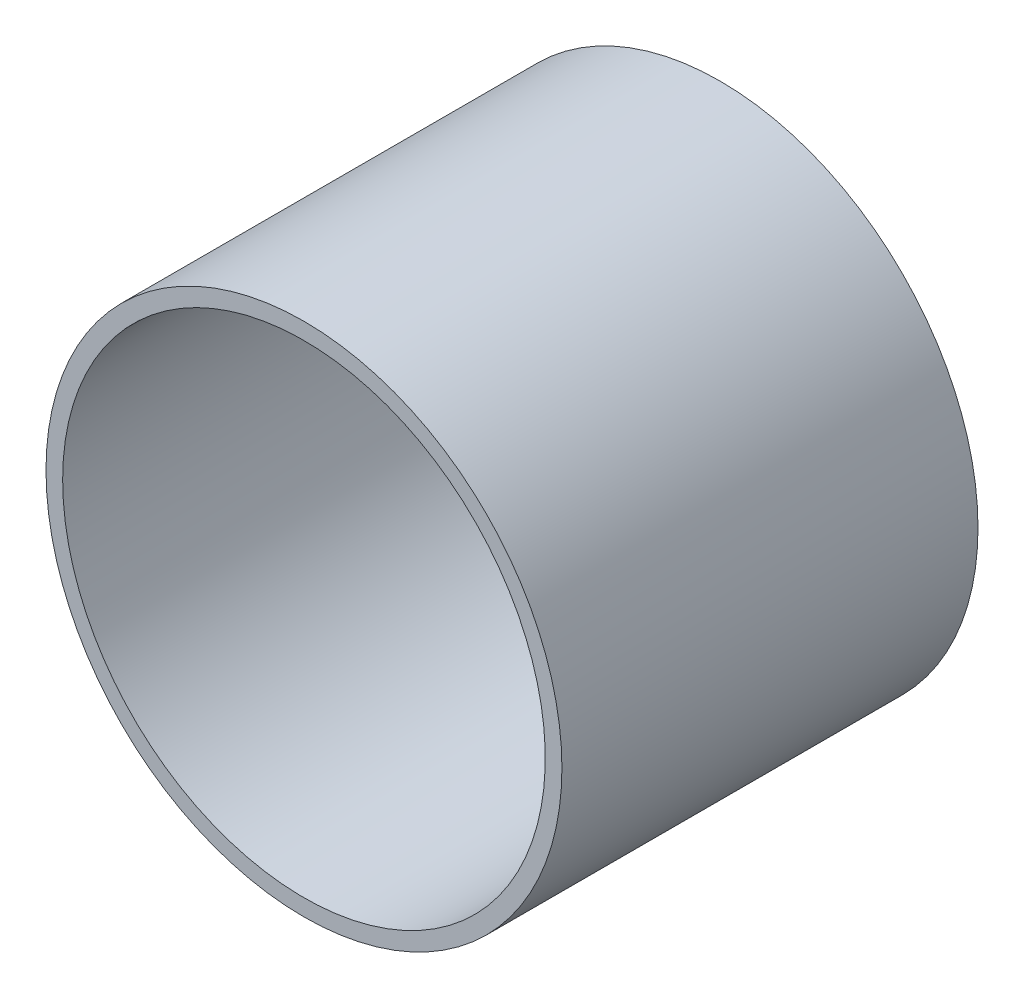
ISO-10303-21;
HEADER;
FILE_DESCRIPTION(('STEP AP214'),'2;1');
FILE_NAME('part.step','',(''),(''),'','','');
FILE_SCHEMA(('AUTOMOTIVE_DESIGN { 1 0 10303 214 1 1 1 1 }'));
ENDSEC;
DATA;
#1=APPLICATION_CONTEXT('core data for automotive mechanical design processes');
#2=APPLICATION_PROTOCOL_DEFINITION('international standard','automotive_design',2000,#1);
#3=PRODUCT_CONTEXT('',#1,'mechanical');
#4=PRODUCT('Part','Part','',(#3));
#5=PRODUCT_RELATED_PRODUCT_CATEGORY('part','',(#4));
#6=PRODUCT_DEFINITION_FORMATION('','',#4);
#7=PRODUCT_DEFINITION_CONTEXT('part definition',#1,'design');
#8=PRODUCT_DEFINITION('design','',#6,#7);
#9=PRODUCT_DEFINITION_SHAPE('','',#8);
#10=(LENGTH_UNIT() NAMED_UNIT(*) SI_UNIT(.MILLI.,.METRE.));
#11=(NAMED_UNIT(*) PLANE_ANGLE_UNIT() SI_UNIT($,.RADIAN.));
#12=(NAMED_UNIT(*) SI_UNIT($,.STERADIAN.) SOLID_ANGLE_UNIT());
#13=UNCERTAINTY_MEASURE_WITH_UNIT(LENGTH_MEASURE(1.E-05),#10,'distance_accuracy_value','');
#14=(GEOMETRIC_REPRESENTATION_CONTEXT(3) GLOBAL_UNCERTAINTY_ASSIGNED_CONTEXT((#13)) GLOBAL_UNIT_ASSIGNED_CONTEXT((#10,
#11,#12)) REPRESENTATION_CONTEXT('',''));
#15=CARTESIAN_POINT('',(0.,0.,0.));
#16=DIRECTION('',(0.,0.,1.));
#17=DIRECTION('',(1.,0.,0.));
#18=AXIS2_PLACEMENT_3D('',#15,#16,#17);
#19=CARTESIAN_POINT('',(-19.9644961793982,17.4690871369295,50.));
#20=DIRECTION('',(0.,0.,-1.));
#21=DIRECTION('',(-1.,0.,0.));
#22=AXIS2_PLACEMENT_3D('',#19,#20,#21);
#23=CYLINDRICAL_SURFACE('',#22,29.);
#24=CARTESIAN_POINT('',(-19.9644961793982,17.4690871369295,0.));
#25=DIRECTION('',(0.,0.,-1.));
#26=DIRECTION('',(-1.,0.,0.));
#27=AXIS2_PLACEMENT_3D('',#24,#25,#26);
#28=CIRCLE('',#27,29.);
#29=CARTESIAN_POINT('',(-48.9644961793982,17.4690871369295,0.));
#30=VERTEX_POINT('',#29);
#31=EDGE_CURVE('E27',#30,#30,#28,.T.);
#32=ORIENTED_EDGE('',*,*,#31,.T.);
#33=EDGE_LOOP('',(#32));
#34=FACE_BOUND('',#33,.T.);
#35=CARTESIAN_POINT('',(-19.9644961793982,17.4690871369295,50.));
#36=DIRECTION('',(0.,0.,-1.));
#37=DIRECTION('',(-1.,0.,0.));
#38=AXIS2_PLACEMENT_3D('',#35,#36,#37);
#39=CIRCLE('',#38,29.);
#40=CARTESIAN_POINT('',(-48.9644961793982,17.4690871369295,50.));
#41=VERTEX_POINT('',#40);
#42=EDGE_CURVE('E18',#41,#41,#39,.T.);
#43=ORIENTED_EDGE('',*,*,#42,.F.);
#44=EDGE_LOOP('',(#43));
#45=FACE_BOUND('',#44,.T.);
#46=ADVANCED_FACE('F15',(#34,#45),#23,.F.);
#47=CARTESIAN_POINT('',(-19.9644961793982,17.4690871369295,50.));
#48=DIRECTION('',(0.,0.,1.));
#49=DIRECTION('',(1.,0.,0.));
#50=AXIS2_PLACEMENT_3D('',#47,#48,#49);
#51=PLANE('',#50);
#52=ORIENTED_EDGE('',*,*,#42,.T.);
#53=EDGE_LOOP('',(#52));
#54=FACE_BOUND('',#53,.T.);
#55=CARTESIAN_POINT('',(-19.9644961793982,17.4690871369295,50.));
#56=DIRECTION('',(0.,0.,-1.));
#57=DIRECTION('',(-1.,0.,0.));
#58=AXIS2_PLACEMENT_3D('',#55,#56,#57);
#59=CIRCLE('',#58,31.);
#60=CARTESIAN_POINT('',(-50.9644961793982,17.4690871369295,50.));
#61=VERTEX_POINT('',#60);
#62=EDGE_CURVE('E22',#61,#61,#59,.T.);
#63=ORIENTED_EDGE('',*,*,#62,.F.);
#64=EDGE_LOOP('',(#63));
#65=FACE_BOUND('',#64,.T.);
#66=ADVANCED_FACE('F35',(#54,#65),#51,.T.);
#67=CARTESIAN_POINT('',(-19.9644961793982,17.4690871369295,0.));
#68=DIRECTION('',(0.,0.,1.));
#69=DIRECTION('',(1.,0.,0.));
#70=AXIS2_PLACEMENT_3D('',#67,#68,#69);
#71=PLANE('',#70);
#72=ORIENTED_EDGE('',*,*,#31,.F.);
#73=EDGE_LOOP('',(#72));
#74=FACE_BOUND('',#73,.T.);
#75=CARTESIAN_POINT('',(-19.9644961793982,17.4690871369295,0.));
#76=DIRECTION('',(0.,0.,-1.));
#77=DIRECTION('',(-1.,0.,0.));
#78=AXIS2_PLACEMENT_3D('',#75,#76,#77);
#79=CIRCLE('',#78,31.);
#80=CARTESIAN_POINT('',(-50.9644961793982,17.4690871369295,0.));
#81=VERTEX_POINT('',#80);
#82=EDGE_CURVE('E10',#81,#81,#79,.F.);
#83=ORIENTED_EDGE('',*,*,#82,.F.);
#84=EDGE_LOOP('',(#83));
#85=FACE_BOUND('',#84,.T.);
#86=ADVANCED_FACE('F43',(#74,#85),#71,.F.);
#87=CARTESIAN_POINT('',(-19.9644961793982,17.4690871369295,50.));
#88=DIRECTION('',(0.,0.,-1.));
#89=DIRECTION('',(-1.,0.,0.));
#90=AXIS2_PLACEMENT_3D('',#87,#88,#89);
#91=CYLINDRICAL_SURFACE('',#90,31.);
#92=ORIENTED_EDGE('',*,*,#82,.T.);
#93=EDGE_LOOP('',(#92));
#94=FACE_BOUND('',#93,.T.);
#95=ORIENTED_EDGE('',*,*,#62,.T.);
#96=EDGE_LOOP('',(#95));
#97=FACE_BOUND('',#96,.T.);
#98=ADVANCED_FACE('F44',(#94,#97),#91,.T.);
#99=CLOSED_SHELL('',(#46,#66,#86,#98));
#100=MANIFOLD_SOLID_BREP('B1',#99);
#101=ADVANCED_BREP_SHAPE_REPRESENTATION('',(#18,#100),#14);
#102=SHAPE_DEFINITION_REPRESENTATION(#9,#101);
ENDSEC;
END-ISO-10303-21;
